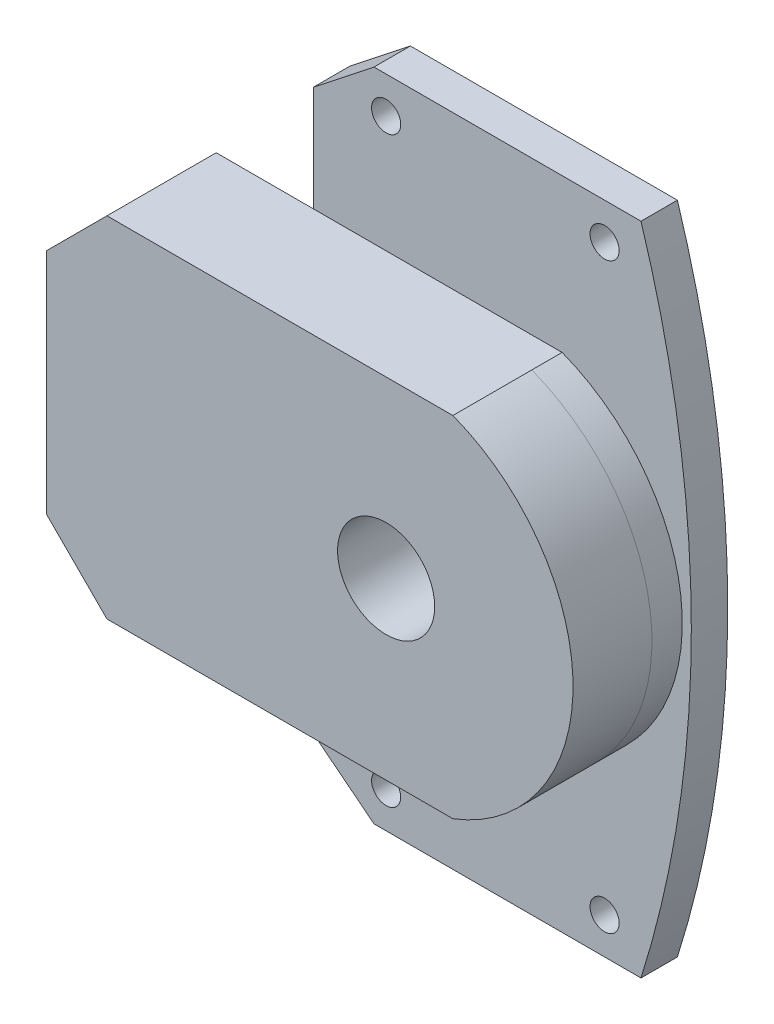
ISO-10303-21;
HEADER;
FILE_DESCRIPTION(('STEP AP214'),'2;1');
FILE_NAME('part.step','',(''),(''),'','','');
FILE_SCHEMA(('AUTOMOTIVE_DESIGN { 1 0 10303 214 1 1 1 1 }'));
ENDSEC;
DATA;
#1=APPLICATION_CONTEXT('core data for automotive mechanical design processes');
#2=APPLICATION_PROTOCOL_DEFINITION('international standard','automotive_design',2000,#1);
#3=PRODUCT_CONTEXT('',#1,'mechanical');
#4=PRODUCT('Part','Part','',(#3));
#5=PRODUCT_RELATED_PRODUCT_CATEGORY('part','',(#4));
#6=PRODUCT_DEFINITION_FORMATION('','',#4);
#7=PRODUCT_DEFINITION_CONTEXT('part definition',#1,'design');
#8=PRODUCT_DEFINITION('design','',#6,#7);
#9=PRODUCT_DEFINITION_SHAPE('','',#8);
#10=(LENGTH_UNIT() NAMED_UNIT(*) SI_UNIT(.MILLI.,.METRE.));
#11=(NAMED_UNIT(*) PLANE_ANGLE_UNIT() SI_UNIT($,.RADIAN.));
#12=(NAMED_UNIT(*) SI_UNIT($,.STERADIAN.) SOLID_ANGLE_UNIT());
#13=UNCERTAINTY_MEASURE_WITH_UNIT(LENGTH_MEASURE(1.E-05),#10,'distance_accuracy_value','');
#14=(GEOMETRIC_REPRESENTATION_CONTEXT(3) GLOBAL_UNCERTAINTY_ASSIGNED_CONTEXT((#13)) GLOBAL_UNIT_ASSIGNED_CONTEXT((#10,
#11,#12)) REPRESENTATION_CONTEXT('',''));
#15=CARTESIAN_POINT('',(0.,0.,0.));
#16=DIRECTION('',(0.,0.,1.));
#17=DIRECTION('',(1.,0.,0.));
#18=AXIS2_PLACEMENT_3D('',#15,#16,#17);
#19=CARTESIAN_POINT('',(-87.5169435511757,-10.5980462863294,-3.));
#20=DIRECTION('',(0.,0.,1.));
#21=DIRECTION('',(1.,0.,0.));
#22=AXIS2_PLACEMENT_3D('',#19,#20,#21);
#23=PLANE('',#22);
#24=CARTESIAN_POINT('',(-87.5169435511757,-10.5980462863294,-3.));
#25=DIRECTION('',(0.,0.,-1.));
#26=DIRECTION('',(1.,0.,0.));
#27=AXIS2_PLACEMENT_3D('',#24,#25,#26);
#28=CIRCLE('',#27,90.);
#29=CARTESIAN_POINT('',(-1.66241542365061,16.4019537136706,-3.));
#30=VERTEX_POINT('',#29);
#31=CARTESIAN_POINT('',(-1.66241542365062,-37.5980462863294,-3.));
#32=VERTEX_POINT('',#31);
#33=EDGE_CURVE('E143',#30,#32,#28,.T.);
#34=ORIENTED_EDGE('',*,*,#33,.T.);
#35=DIRECTION('',(-1.,0.,0.));
#36=VECTOR('',#35,1.);
#37=CARTESIAN_POINT('',(-23.6624154236506,-37.5980462863294,-3.));
#38=LINE('',#37,#36);
#39=CARTESIAN_POINT('',(-23.6624154236506,-37.5980462863294,-3.));
#40=VERTEX_POINT('',#39);
#41=EDGE_CURVE('E101',#32,#40,#38,.T.);
#42=ORIENTED_EDGE('',*,*,#41,.T.);
#43=DIRECTION('',(-0.785278343538106,0.619142893983327,0.));
#44=VECTOR('',#43,1.);
#45=CARTESIAN_POINT('',(-28.6624154236506,-33.6558587863294,-3.));
#46=LINE('',#45,#44);
#47=CARTESIAN_POINT('',(-28.6624154236506,-33.6558587863294,-3.));
#48=VERTEX_POINT('',#47);
#49=EDGE_CURVE('E114',#40,#48,#46,.T.);
#50=ORIENTED_EDGE('',*,*,#49,.T.);
#51=DIRECTION('',(0.,1.,0.));
#52=VECTOR('',#51,1.);
#53=CARTESIAN_POINT('',(-28.6624154236506,12.4597662136706,-3.));
#54=LINE('',#53,#52);
#55=CARTESIAN_POINT('',(-28.6624154236506,12.4597662136706,-3.));
#56=VERTEX_POINT('',#55);
#57=EDGE_CURVE('E108',#48,#56,#54,.T.);
#58=ORIENTED_EDGE('',*,*,#57,.T.);
#59=DIRECTION('',(0.785278343538106,0.619142893983326,0.));
#60=VECTOR('',#59,1.);
#61=CARTESIAN_POINT('',(-23.6624154236506,16.4019537136706,-3.));
#62=LINE('',#61,#60);
#63=CARTESIAN_POINT('',(-23.6624154236506,16.4019537136706,-3.));
#64=VERTEX_POINT('',#63);
#65=EDGE_CURVE('E112',#56,#64,#62,.T.);
#66=ORIENTED_EDGE('',*,*,#65,.T.);
#67=DIRECTION('',(1.,0.,0.));
#68=VECTOR('',#67,1.);
#69=CARTESIAN_POINT('',(-23.6624154236506,16.4019537136706,-3.));
#70=LINE('',#69,#68);
#71=EDGE_CURVE('E64',#64,#30,#70,.T.);
#72=ORIENTED_EDGE('',*,*,#71,.T.);
#73=EDGE_LOOP('',(#34,#42,#50,#58,#66,#72));
#74=FACE_BOUND('',#73,.T.);
#75=CARTESIAN_POINT('',(-13.6624154236506,-10.5980462863294,-3.));
#76=DIRECTION('',(0.,0.,-1.));
#77=DIRECTION('',(-1.,0.,0.));
#78=AXIS2_PLACEMENT_3D('',#75,#76,#77);
#79=CIRCLE('',#78,3.9);
#80=CARTESIAN_POINT('',(-17.5624154236506,-10.5980462863294,-3.));
#81=VERTEX_POINT('',#80);
#82=EDGE_CURVE('E136',#81,#81,#79,.T.);
#83=ORIENTED_EDGE('',*,*,#82,.F.);
#84=EDGE_LOOP('',(#83));
#85=FACE_BOUND('',#84,.T.);
#86=CARTESIAN_POINT('',(-4.66241542365062,13.4019537136706,-3.));
#87=DIRECTION('',(0.,0.,-1.));
#88=DIRECTION('',(-1.,0.,0.));
#89=AXIS2_PLACEMENT_3D('',#86,#87,#88);
#90=CIRCLE('',#89,1.2);
#91=CARTESIAN_POINT('',(-5.86241542365062,13.4019537136706,-3.));
#92=VERTEX_POINT('',#91);
#93=EDGE_CURVE('E217',#92,#92,#90,.T.);
#94=ORIENTED_EDGE('',*,*,#93,.F.);
#95=EDGE_LOOP('',(#94));
#96=FACE_BOUND('',#95,.T.);
#97=CARTESIAN_POINT('',(-22.6624154236506,13.4019537136706,-3.));
#98=DIRECTION('',(0.,0.,-1.));
#99=DIRECTION('',(1.,0.,0.));
#100=AXIS2_PLACEMENT_3D('',#97,#98,#99);
#101=CIRCLE('',#100,1.2);
#102=CARTESIAN_POINT('',(-21.4624154236506,13.4019537136706,-3.));
#103=VERTEX_POINT('',#102);
#104=EDGE_CURVE('E211',#103,#103,#101,.T.);
#105=ORIENTED_EDGE('',*,*,#104,.F.);
#106=EDGE_LOOP('',(#105));
#107=FACE_BOUND('',#106,.T.);
#108=CARTESIAN_POINT('',(-4.66241542365062,-34.5980462863294,-3.));
#109=DIRECTION('',(0.,0.,-1.));
#110=DIRECTION('',(1.,0.,0.));
#111=AXIS2_PLACEMENT_3D('',#108,#109,#110);
#112=CIRCLE('',#111,1.2);
#113=CARTESIAN_POINT('',(-3.46241542365062,-34.5980462863294,-3.));
#114=VERTEX_POINT('',#113);
#115=EDGE_CURVE('E205',#114,#114,#112,.T.);
#116=ORIENTED_EDGE('',*,*,#115,.F.);
#117=EDGE_LOOP('',(#116));
#118=FACE_BOUND('',#117,.T.);
#119=CARTESIAN_POINT('',(-22.6624154236506,-34.5980462863294,-3.));
#120=DIRECTION('',(0.,0.,-1.));
#121=DIRECTION('',(-1.,0.,0.));
#122=AXIS2_PLACEMENT_3D('',#119,#120,#121);
#123=CIRCLE('',#122,1.2);
#124=CARTESIAN_POINT('',(-23.8624154236506,-34.5980462863294,-3.));
#125=VERTEX_POINT('',#124);
#126=EDGE_CURVE('E196',#125,#125,#123,.T.);
#127=ORIENTED_EDGE('',*,*,#126,.F.);
#128=EDGE_LOOP('',(#127));
#129=FACE_BOUND('',#128,.T.);
#130=ADVANCED_FACE('F47',(#74,#85,#96,#107,#118,#129),#23,.F.);
#131=CARTESIAN_POINT('',(-87.5169435511757,-10.5980462863294,0.));
#132=DIRECTION('',(0.,0.,1.));
#133=DIRECTION('',(1.,0.,0.));
#134=AXIS2_PLACEMENT_3D('',#131,#132,#133);
#135=PLANE('',#134);
#136=CARTESIAN_POINT('',(-4.66241542365062,-34.5980462863294,0.));
#137=DIRECTION('',(0.,0.,-1.));
#138=DIRECTION('',(1.,0.,0.));
#139=AXIS2_PLACEMENT_3D('',#136,#137,#138);
#140=CIRCLE('',#139,1.2);
#141=CARTESIAN_POINT('',(-3.46241542365062,-34.5980462863294,0.));
#142=VERTEX_POINT('',#141);
#143=EDGE_CURVE('E202',#142,#142,#140,.T.);
#144=ORIENTED_EDGE('',*,*,#143,.T.);
#145=EDGE_LOOP('',(#144));
#146=FACE_BOUND('',#145,.T.);
#147=CARTESIAN_POINT('',(-4.66241542365062,13.4019537136706,0.));
#148=DIRECTION('',(0.,0.,-1.));
#149=DIRECTION('',(-1.,0.,0.));
#150=AXIS2_PLACEMENT_3D('',#147,#148,#149);
#151=CIRCLE('',#150,1.2);
#152=CARTESIAN_POINT('',(-5.86241542365062,13.4019537136706,0.));
#153=VERTEX_POINT('',#152);
#154=EDGE_CURVE('E214',#153,#153,#151,.T.);
#155=ORIENTED_EDGE('',*,*,#154,.T.);
#156=EDGE_LOOP('',(#155));
#157=FACE_BOUND('',#156,.T.);
#158=CARTESIAN_POINT('',(-87.5169435511757,-10.5980462863294,0.));
#159=DIRECTION('',(0.,0.,-1.));
#160=DIRECTION('',(1.,0.,0.));
#161=AXIS2_PLACEMENT_3D('',#158,#159,#160);
#162=CIRCLE('',#161,90.);
#163=CARTESIAN_POINT('',(-1.66241542365061,16.4019537136706,0.));
#164=VERTEX_POINT('',#163);
#165=CARTESIAN_POINT('',(-1.66241542365062,-37.5980462863294,0.));
#166=VERTEX_POINT('',#165);
#167=EDGE_CURVE('E132',#164,#166,#162,.T.);
#168=ORIENTED_EDGE('',*,*,#167,.F.);
#169=DIRECTION('',(1.,0.,0.));
#170=VECTOR('',#169,1.);
#171=CARTESIAN_POINT('',(-23.6624154236506,16.4019537136706,0.));
#172=LINE('',#171,#170);
#173=CARTESIAN_POINT('',(-23.6624154236506,16.4019537136706,0.));
#174=VERTEX_POINT('',#173);
#175=EDGE_CURVE('E93',#174,#164,#172,.T.);
#176=ORIENTED_EDGE('',*,*,#175,.F.);
#177=DIRECTION('',(0.785278343538106,0.619142893983326,0.));
#178=VECTOR('',#177,1.);
#179=CARTESIAN_POINT('',(-23.6624154236506,16.4019537136706,0.));
#180=LINE('',#179,#178);
#181=CARTESIAN_POINT('',(-28.6624154236506,12.4597662136706,0.));
#182=VERTEX_POINT('',#181);
#183=EDGE_CURVE('E87',#182,#174,#180,.T.);
#184=ORIENTED_EDGE('',*,*,#183,.F.);
#185=DIRECTION('',(0.,1.,0.));
#186=VECTOR('',#185,1.);
#187=CARTESIAN_POINT('',(-28.6624154236506,12.4597662136706,0.));
#188=LINE('',#187,#186);
#189=CARTESIAN_POINT('',(-28.6624154236506,-33.6558587863294,0.));
#190=VERTEX_POINT('',#189);
#191=EDGE_CURVE('E122',#190,#182,#188,.T.);
#192=ORIENTED_EDGE('',*,*,#191,.F.);
#193=DIRECTION('',(-0.785278343538106,0.619142893983327,0.));
#194=VECTOR('',#193,1.);
#195=CARTESIAN_POINT('',(-28.6624154236506,-33.6558587863294,0.));
#196=LINE('',#195,#194);
#197=CARTESIAN_POINT('',(-23.6624154236506,-37.5980462863294,0.));
#198=VERTEX_POINT('',#197);
#199=EDGE_CURVE('E138',#198,#190,#196,.T.);
#200=ORIENTED_EDGE('',*,*,#199,.F.);
#201=DIRECTION('',(-1.,0.,0.));
#202=VECTOR('',#201,1.);
#203=CARTESIAN_POINT('',(-23.6624154236506,-37.5980462863294,0.));
#204=LINE('',#203,#202);
#205=EDGE_CURVE('E135',#166,#198,#204,.T.);
#206=ORIENTED_EDGE('',*,*,#205,.F.);
#207=EDGE_LOOP('',(#168,#176,#184,#192,#200,#206));
#208=FACE_BOUND('',#207,.T.);
#209=CARTESIAN_POINT('',(-13.6624154236506,-10.5980462863294,0.));
#210=DIRECTION('',(0.,0.,-1.));
#211=DIRECTION('',(-1.,0.,0.));
#212=AXIS2_PLACEMENT_3D('',#209,#210,#211);
#213=CIRCLE('',#212,3.9);
#214=CARTESIAN_POINT('',(-17.5624154236506,-10.5980462863294,0.));
#215=VERTEX_POINT('',#214);
#216=EDGE_CURVE('E220',#215,#215,#213,.T.);
#217=ORIENTED_EDGE('',*,*,#216,.T.);
#218=EDGE_LOOP('',(#217));
#219=FACE_BOUND('',#218,.T.);
#220=CARTESIAN_POINT('',(-22.6624154236506,13.4019537136706,0.));
#221=DIRECTION('',(0.,0.,-1.));
#222=DIRECTION('',(1.,0.,0.));
#223=AXIS2_PLACEMENT_3D('',#220,#221,#222);
#224=CIRCLE('',#223,1.2);
#225=CARTESIAN_POINT('',(-21.4624154236506,13.4019537136706,0.));
#226=VERTEX_POINT('',#225);
#227=EDGE_CURVE('E208',#226,#226,#224,.T.);
#228=ORIENTED_EDGE('',*,*,#227,.T.);
#229=EDGE_LOOP('',(#228));
#230=FACE_BOUND('',#229,.T.);
#231=CARTESIAN_POINT('',(-22.6624154236506,-34.5980462863294,0.));
#232=DIRECTION('',(0.,0.,-1.));
#233=DIRECTION('',(-1.,0.,0.));
#234=AXIS2_PLACEMENT_3D('',#231,#232,#233);
#235=CIRCLE('',#234,1.2);
#236=CARTESIAN_POINT('',(-23.8624154236506,-34.5980462863294,0.));
#237=VERTEX_POINT('',#236);
#238=EDGE_CURVE('E199',#237,#237,#235,.T.);
#239=ORIENTED_EDGE('',*,*,#238,.T.);
#240=EDGE_LOOP('',(#239));
#241=FACE_BOUND('',#240,.T.);
#242=ADVANCED_FACE('F152',(#146,#157,#208,#219,#230,#241),#135,.T.);
#243=CARTESIAN_POINT('',(-87.5169435511757,-10.5980462863294,-3.));
#244=DIRECTION('',(0.,0.,1.));
#245=DIRECTION('',(1.,0.,0.));
#246=AXIS2_PLACEMENT_3D('',#243,#244,#245);
#247=CYLINDRICAL_SURFACE('',#246,90.);
#248=ORIENTED_EDGE('',*,*,#167,.T.);
#249=DIRECTION('',(0.,0.,1.));
#250=VECTOR('',#249,1.);
#251=CARTESIAN_POINT('',(-1.66241542365062,-37.5980462863294,-3.));
#252=LINE('',#251,#250);
#253=EDGE_CURVE('E12',#32,#166,#252,.T.);
#254=ORIENTED_EDGE('',*,*,#253,.F.);
#255=ORIENTED_EDGE('',*,*,#33,.F.);
#256=DIRECTION('',(0.,0.,1.));
#257=VECTOR('',#256,1.);
#258=CARTESIAN_POINT('',(-1.66241542365061,16.4019537136706,-3.));
#259=LINE('',#258,#257);
#260=EDGE_CURVE('E128',#30,#164,#259,.T.);
#261=ORIENTED_EDGE('',*,*,#260,.T.);
#262=EDGE_LOOP('',(#248,#254,#255,#261));
#263=FACE_BOUND('',#262,.T.);
#264=ADVANCED_FACE('F49',(#263),#247,.T.);
#265=CARTESIAN_POINT('',(-23.6624154236506,-37.5980462863294,-3.));
#266=DIRECTION('',(0.,1.,0.));
#267=DIRECTION('',(0.,0.,1.));
#268=AXIS2_PLACEMENT_3D('',#265,#266,#267);
#269=PLANE('',#268);
#270=ORIENTED_EDGE('',*,*,#205,.T.);
#271=DIRECTION('',(0.,0.,1.));
#272=VECTOR('',#271,1.);
#273=CARTESIAN_POINT('',(-23.6624154236506,-37.5980462863294,-3.));
#274=LINE('',#273,#272);
#275=EDGE_CURVE('E56',#40,#198,#274,.T.);
#276=ORIENTED_EDGE('',*,*,#275,.F.);
#277=ORIENTED_EDGE('',*,*,#41,.F.);
#278=ORIENTED_EDGE('',*,*,#253,.T.);
#279=EDGE_LOOP('',(#270,#276,#277,#278));
#280=FACE_BOUND('',#279,.T.);
#281=ADVANCED_FACE('F289',(#280),#269,.F.);
#282=CARTESIAN_POINT('',(-28.6624154236506,-33.6558587863294,-3.));
#283=DIRECTION('',(0.619142893983327,0.785278343538106,0.));
#284=DIRECTION('',(-0.785278343538106,0.619142893983327,0.));
#285=AXIS2_PLACEMENT_3D('',#282,#283,#284);
#286=PLANE('',#285);
#287=ORIENTED_EDGE('',*,*,#199,.T.);
#288=DIRECTION('',(0.,0.,1.));
#289=VECTOR('',#288,1.);
#290=CARTESIAN_POINT('',(-28.6624154236506,-33.6558587863294,-3.));
#291=LINE('',#290,#289);
#292=EDGE_CURVE('E123',#48,#190,#291,.T.);
#293=ORIENTED_EDGE('',*,*,#292,.F.);
#294=ORIENTED_EDGE('',*,*,#49,.F.);
#295=ORIENTED_EDGE('',*,*,#275,.T.);
#296=EDGE_LOOP('',(#287,#293,#294,#295));
#297=FACE_BOUND('',#296,.T.);
#298=ADVANCED_FACE('F149',(#297),#286,.F.);
#299=CARTESIAN_POINT('',(-28.6624154236506,12.4597662136706,-3.));
#300=DIRECTION('',(1.,0.,0.));
#301=DIRECTION('',(0.,1.,0.));
#302=AXIS2_PLACEMENT_3D('',#299,#300,#301);
#303=PLANE('',#302);
#304=ORIENTED_EDGE('',*,*,#191,.T.);
#305=DIRECTION('',(0.,0.,1.));
#306=VECTOR('',#305,1.);
#307=CARTESIAN_POINT('',(-28.6624154236506,12.4597662136706,-3.));
#308=LINE('',#307,#306);
#309=EDGE_CURVE('E119',#56,#182,#308,.T.);
#310=ORIENTED_EDGE('',*,*,#309,.F.);
#311=ORIENTED_EDGE('',*,*,#57,.F.);
#312=ORIENTED_EDGE('',*,*,#292,.T.);
#313=EDGE_LOOP('',(#304,#310,#311,#312));
#314=FACE_BOUND('',#313,.T.);
#315=ADVANCED_FACE('F120',(#314),#303,.F.);
#316=CARTESIAN_POINT('',(-23.6624154236506,16.4019537136706,-3.));
#317=DIRECTION('',(0.619142893983326,-0.785278343538106,0.));
#318=DIRECTION('',(0.785278343538106,0.619142893983326,0.));
#319=AXIS2_PLACEMENT_3D('',#316,#317,#318);
#320=PLANE('',#319);
#321=ORIENTED_EDGE('',*,*,#183,.T.);
#322=DIRECTION('',(0.,0.,1.));
#323=VECTOR('',#322,1.);
#324=CARTESIAN_POINT('',(-23.6624154236506,16.4019537136706,-3.));
#325=LINE('',#324,#323);
#326=EDGE_CURVE('E124',#64,#174,#325,.T.);
#327=ORIENTED_EDGE('',*,*,#326,.F.);
#328=ORIENTED_EDGE('',*,*,#65,.F.);
#329=ORIENTED_EDGE('',*,*,#309,.T.);
#330=EDGE_LOOP('',(#321,#327,#328,#329));
#331=FACE_BOUND('',#330,.T.);
#332=ADVANCED_FACE('F126',(#331),#320,.F.);
#333=CARTESIAN_POINT('',(-23.6624154236506,16.4019537136706,-3.));
#334=DIRECTION('',(0.,-1.,0.));
#335=DIRECTION('',(0.,0.,-1.));
#336=AXIS2_PLACEMENT_3D('',#333,#334,#335);
#337=PLANE('',#336);
#338=ORIENTED_EDGE('',*,*,#175,.T.);
#339=ORIENTED_EDGE('',*,*,#260,.F.);
#340=ORIENTED_EDGE('',*,*,#71,.F.);
#341=ORIENTED_EDGE('',*,*,#326,.T.);
#342=EDGE_LOOP('',(#338,#339,#340,#341));
#343=FACE_BOUND('',#342,.T.);
#344=ADVANCED_FACE('F157',(#343),#337,.F.);
#345=CARTESIAN_POINT('',(-13.6624154236506,-10.5980462863294,-3.));
#346=DIRECTION('',(0.,0.,1.));
#347=DIRECTION('',(1.,0.,0.));
#348=AXIS2_PLACEMENT_3D('',#345,#346,#347);
#349=CYLINDRICAL_SURFACE('',#348,3.9);
#350=ORIENTED_EDGE('',*,*,#82,.T.);
#351=EDGE_LOOP('',(#350));
#352=FACE_BOUND('',#351,.T.);
#353=ORIENTED_EDGE('',*,*,#216,.F.);
#354=EDGE_LOOP('',(#353));
#355=FACE_BOUND('',#354,.T.);
#356=ADVANCED_FACE('F159',(#352,#355),#349,.F.);
#357=CARTESIAN_POINT('',(-4.66241542365062,13.4019537136706,-3.));
#358=DIRECTION('',(0.,0.,1.));
#359=DIRECTION('',(1.,0.,0.));
#360=AXIS2_PLACEMENT_3D('',#357,#358,#359);
#361=CYLINDRICAL_SURFACE('',#360,1.2);
#362=ORIENTED_EDGE('',*,*,#93,.T.);
#363=EDGE_LOOP('',(#362));
#364=FACE_BOUND('',#363,.T.);
#365=ORIENTED_EDGE('',*,*,#154,.F.);
#366=EDGE_LOOP('',(#365));
#367=FACE_BOUND('',#366,.T.);
#368=ADVANCED_FACE('F165',(#364,#367),#361,.F.);
#369=CARTESIAN_POINT('',(-22.6624154236506,13.4019537136706,-3.));
#370=DIRECTION('',(0.,0.,1.));
#371=DIRECTION('',(1.,0.,0.));
#372=AXIS2_PLACEMENT_3D('',#369,#370,#371);
#373=CYLINDRICAL_SURFACE('',#372,1.2);
#374=ORIENTED_EDGE('',*,*,#104,.T.);
#375=EDGE_LOOP('',(#374));
#376=FACE_BOUND('',#375,.T.);
#377=ORIENTED_EDGE('',*,*,#227,.F.);
#378=EDGE_LOOP('',(#377));
#379=FACE_BOUND('',#378,.T.);
#380=ADVANCED_FACE('F179',(#376,#379),#373,.F.);
#381=CARTESIAN_POINT('',(-4.66241542365062,-34.5980462863294,-3.));
#382=DIRECTION('',(0.,0.,1.));
#383=DIRECTION('',(1.,0.,0.));
#384=AXIS2_PLACEMENT_3D('',#381,#382,#383);
#385=CYLINDRICAL_SURFACE('',#384,1.2);
#386=ORIENTED_EDGE('',*,*,#115,.T.);
#387=EDGE_LOOP('',(#386));
#388=FACE_BOUND('',#387,.T.);
#389=ORIENTED_EDGE('',*,*,#143,.F.);
#390=EDGE_LOOP('',(#389));
#391=FACE_BOUND('',#390,.T.);
#392=ADVANCED_FACE('F183',(#388,#391),#385,.F.);
#393=CARTESIAN_POINT('',(-22.6624154236506,-34.5980462863294,-3.));
#394=DIRECTION('',(0.,0.,1.));
#395=DIRECTION('',(1.,0.,0.));
#396=AXIS2_PLACEMENT_3D('',#393,#394,#395);
#397=CYLINDRICAL_SURFACE('',#396,1.2);
#398=ORIENTED_EDGE('',*,*,#126,.T.);
#399=EDGE_LOOP('',(#398));
#400=FACE_BOUND('',#399,.T.);
#401=ORIENTED_EDGE('',*,*,#238,.F.);
#402=EDGE_LOOP('',(#401));
#403=FACE_BOUND('',#402,.T.);
#404=ADVANCED_FACE('F187',(#400,#403),#397,.F.);
#405=CLOSED_SHELL('',(#130,#242,#264,#281,#298,#315,#332,#344,#356,#368,#380,#392,#404));
#406=MANIFOLD_SOLID_BREP('B2',#405);
#407=CARTESIAN_POINT('',(-13.6624154236506,-10.5980462863294,1.74455679792347E-13));
#408=DIRECTION('',(0.,0.,1.));
#409=DIRECTION('',(1.,0.,0.));
#410=AXIS2_PLACEMENT_3D('',#407,#408,#409);
#411=PLANE('',#410);
#412=DIRECTION('',(-0.707106781186547,-0.707106781186548,0.));
#413=VECTOR('',#412,1.);
#414=CARTESIAN_POINT('',(-36.6624154236506,3.78695371367061,1.74455679792347E-13));
#415=LINE('',#414,#413);
#416=CARTESIAN_POINT('',(-36.6624154236506,3.78695371367061,1.74455679792347E-13));
#417=VERTEX_POINT('',#416);
#418=CARTESIAN_POINT('',(-41.6624154236506,-1.21304628632939,1.74455679792347E-13));
#419=VERTEX_POINT('',#418);
#420=EDGE_CURVE('E387',#417,#419,#415,.T.);
#421=ORIENTED_EDGE('',*,*,#420,.F.);
#422=DIRECTION('',(-1.,0.,0.));
#423=VECTOR('',#422,1.);
#424=CARTESIAN_POINT('',(-19.1624154236506,3.78695371367061,1.74455679792347E-13));
#425=LINE('',#424,#423);
#426=CARTESIAN_POINT('',(-8.16241542365062,3.78695371367061,1.74455679792347E-13));
#427=VERTEX_POINT('',#426);
#428=EDGE_CURVE('E371',#427,#417,#425,.T.);
#429=ORIENTED_EDGE('',*,*,#428,.F.);
#430=CARTESIAN_POINT('',(-13.6624154236506,-10.5980462863294,1.74455679792347E-13));
#431=DIRECTION('',(0.,0.,1.));
#432=DIRECTION('',(1.,0.,0.));
#433=AXIS2_PLACEMENT_3D('',#430,#431,#432);
#434=CIRCLE('',#433,15.4005917094117);
#435=CARTESIAN_POINT('',(-8.16241542365062,-24.9830462863294,1.74455679792347E-13));
#436=VERTEX_POINT('',#435);
#437=EDGE_CURVE('E381',#436,#427,#434,.T.);
#438=ORIENTED_EDGE('',*,*,#437,.F.);
#439=DIRECTION('',(1.,0.,0.));
#440=VECTOR('',#439,1.);
#441=CARTESIAN_POINT('',(-19.1624154236506,-24.9830462863294,1.74455679792347E-13));
#442=LINE('',#441,#440);
#443=CARTESIAN_POINT('',(-36.6624154236506,-24.9830462863294,1.74455679792347E-13));
#444=VERTEX_POINT('',#443);
#445=EDGE_CURVE('E405',#444,#436,#442,.T.);
#446=ORIENTED_EDGE('',*,*,#445,.F.);
#447=DIRECTION('',(0.707106781186548,-0.707106781186547,0.));
#448=VECTOR('',#447,1.);
#449=CARTESIAN_POINT('',(-41.6624154236506,-19.9830462863294,1.74455679792347E-13));
#450=LINE('',#449,#448);
#451=CARTESIAN_POINT('',(-41.6624154236506,-19.9830462863294,1.74455679792347E-13));
#452=VERTEX_POINT('',#451);
#453=EDGE_CURVE('E396',#452,#444,#450,.T.);
#454=ORIENTED_EDGE('',*,*,#453,.F.);
#455=DIRECTION('',(0.,-1.,0.));
#456=VECTOR('',#455,1.);
#457=CARTESIAN_POINT('',(-41.6624154236506,-1.21304628632939,1.74455679792347E-13));
#458=LINE('',#457,#456);
#459=EDGE_CURVE('E393',#419,#452,#458,.T.);
#460=ORIENTED_EDGE('',*,*,#459,.F.);
#461=EDGE_LOOP('',(#421,#429,#438,#446,#454,#460));
#462=FACE_BOUND('',#461,.T.);
#463=CARTESIAN_POINT('',(-29.4124154236506,-21.0780462863294,1.74455679792347E-13));
#464=DIRECTION('',(0.,0.,1.));
#465=DIRECTION('',(1.,0.,0.));
#466=AXIS2_PLACEMENT_3D('',#463,#464,#465);
#467=CIRCLE('',#466,1.98);
#468=CARTESIAN_POINT('',(-27.4324154236506,-21.0780462863294,1.74455679792347E-13));
#469=VERTEX_POINT('',#468);
#470=EDGE_CURVE('E394',#469,#469,#467,.T.);
#471=ORIENTED_EDGE('',*,*,#470,.T.);
#472=EDGE_LOOP('',(#471));
#473=FACE_BOUND('',#472,.T.);
#474=CARTESIAN_POINT('',(-29.4124154236506,-0.118046286329387,1.74455679792347E-13));
#475=DIRECTION('',(0.,0.,1.));
#476=DIRECTION('',(1.,0.,0.));
#477=AXIS2_PLACEMENT_3D('',#474,#475,#476);
#478=CIRCLE('',#477,1.98);
#479=CARTESIAN_POINT('',(-27.4324154236506,-0.118046286329387,1.74455679792347E-13));
#480=VERTEX_POINT('',#479);
#481=EDGE_CURVE('E399',#480,#480,#478,.T.);
#482=ORIENTED_EDGE('',*,*,#481,.T.);
#483=EDGE_LOOP('',(#482));
#484=FACE_BOUND('',#483,.T.);
#485=CARTESIAN_POINT('',(-13.6624154236506,-10.5980462863294,1.74455679792347E-13));
#486=DIRECTION('',(0.,0.,1.));
#487=DIRECTION('',(1.,0.,0.));
#488=AXIS2_PLACEMENT_3D('',#485,#486,#487);
#489=CIRCLE('',#488,6.3);
#490=CARTESIAN_POINT('',(-7.36241542365062,-10.5980462863294,1.74455679792347E-13));
#491=VERTEX_POINT('',#490);
#492=EDGE_CURVE('E580',#491,#491,#489,.T.);
#493=ORIENTED_EDGE('',*,*,#492,.T.);
#494=EDGE_LOOP('',(#493));
#495=FACE_BOUND('',#494,.T.);
#496=CARTESIAN_POINT('',(-13.6624154236506,-1.07304628632939,1.74455679792347E-13));
#497=DIRECTION('',(0.,0.,1.));
#498=DIRECTION('',(1.,0.,0.));
#499=AXIS2_PLACEMENT_3D('',#496,#497,#498);
#500=CIRCLE('',#499,1.475);
#501=CARTESIAN_POINT('',(-12.1874154236506,-1.07304628632939,1.74455679792347E-13));
#502=VERTEX_POINT('',#501);
#503=EDGE_CURVE('E577',#502,#502,#500,.T.);
#504=ORIENTED_EDGE('',*,*,#503,.T.);
#505=EDGE_LOOP('',(#504));
#506=FACE_BOUND('',#505,.T.);
#507=CARTESIAN_POINT('',(-13.6624154236506,-20.1230462863294,1.74455679792347E-13));
#508=DIRECTION('',(0.,0.,1.));
#509=DIRECTION('',(1.,0.,0.));
#510=AXIS2_PLACEMENT_3D('',#507,#508,#509);
#511=CIRCLE('',#510,1.475);
#512=CARTESIAN_POINT('',(-12.1874154236506,-20.1230462863294,1.74455679792347E-13));
#513=VERTEX_POINT('',#512);
#514=EDGE_CURVE('E574',#513,#513,#511,.T.);
#515=ORIENTED_EDGE('',*,*,#514,.T.);
#516=EDGE_LOOP('',(#515));
#517=FACE_BOUND('',#516,.T.);
#518=CARTESIAN_POINT('',(-4.6821593025815,-19.5783024073986,1.74455679792347E-13));
#519=DIRECTION('',(0.,0.,1.));
#520=DIRECTION('',(1.,0.,0.));
#521=AXIS2_PLACEMENT_3D('',#518,#519,#520);
#522=CIRCLE('',#521,1.05);
#523=CARTESIAN_POINT('',(-3.6321593025815,-19.5783024073986,1.74455679792347E-13));
#524=VERTEX_POINT('',#523);
#525=EDGE_CURVE('E571',#524,#524,#522,.T.);
#526=ORIENTED_EDGE('',*,*,#525,.T.);
#527=EDGE_LOOP('',(#526));
#528=FACE_BOUND('',#527,.T.);
#529=CARTESIAN_POINT('',(-4.6821593025815,-1.61779016526022,1.74455679792347E-13));
#530=DIRECTION('',(0.,0.,1.));
#531=DIRECTION('',(1.,0.,0.));
#532=AXIS2_PLACEMENT_3D('',#529,#530,#531);
#533=CIRCLE('',#532,1.05);
#534=CARTESIAN_POINT('',(-3.6321593025815,-1.61779016526022,1.74455679792347E-13));
#535=VERTEX_POINT('',#534);
#536=EDGE_CURVE('E568',#535,#535,#533,.T.);
#537=ORIENTED_EDGE('',*,*,#536,.T.);
#538=EDGE_LOOP('',(#537));
#539=FACE_BOUND('',#538,.T.);
#540=CARTESIAN_POINT('',(-22.6426715447198,-1.61779016526022,1.74455679792347E-13));
#541=DIRECTION('',(0.,0.,1.));
#542=DIRECTION('',(1.,0.,0.));
#543=AXIS2_PLACEMENT_3D('',#540,#541,#542);
#544=CIRCLE('',#543,1.05);
#545=CARTESIAN_POINT('',(-21.5926715447198,-1.61779016526022,1.74455679792347E-13));
#546=VERTEX_POINT('',#545);
#547=EDGE_CURVE('E565',#546,#546,#544,.T.);
#548=ORIENTED_EDGE('',*,*,#547,.T.);
#549=EDGE_LOOP('',(#548));
#550=FACE_BOUND('',#549,.T.);
#551=CARTESIAN_POINT('',(-22.6426715447198,-19.5783024073986,1.74455679792347E-13));
#552=DIRECTION('',(0.,0.,1.));
#553=DIRECTION('',(1.,0.,0.));
#554=AXIS2_PLACEMENT_3D('',#551,#552,#553);
#555=CIRCLE('',#554,1.05);
#556=CARTESIAN_POINT('',(-21.5926715447198,-19.5783024073986,1.74455679792347E-13));
#557=VERTEX_POINT('',#556);
#558=EDGE_CURVE('E562',#557,#557,#555,.T.);
#559=ORIENTED_EDGE('',*,*,#558,.T.);
#560=EDGE_LOOP('',(#559));
#561=FACE_BOUND('',#560,.T.);
#562=CARTESIAN_POINT('',(-17.6624154236506,-3.66984305605386,1.74455679792347E-13));
#563=DIRECTION('',(0.,0.,1.));
#564=DIRECTION('',(1.,0.,0.));
#565=AXIS2_PLACEMENT_3D('',#562,#563,#564);
#566=CIRCLE('',#565,0.85);
#567=CARTESIAN_POINT('',(-16.8124154236506,-3.66984305605386,1.74455679792347E-13));
#568=VERTEX_POINT('',#567);
#569=EDGE_CURVE('E559',#568,#568,#566,.T.);
#570=ORIENTED_EDGE('',*,*,#569,.T.);
#571=EDGE_LOOP('',(#570));
#572=FACE_BOUND('',#571,.T.);
#573=CARTESIAN_POINT('',(-9.66241542365067,-17.5262495166049,1.74455679792347E-13));
#574=DIRECTION('',(0.,0.,1.));
#575=DIRECTION('',(1.,0.,0.));
#576=AXIS2_PLACEMENT_3D('',#573,#574,#575);
#577=CIRCLE('',#576,0.85);
#578=CARTESIAN_POINT('',(-8.81241542365067,-17.5262495166049,1.74455679792347E-13));
#579=VERTEX_POINT('',#578);
#580=EDGE_CURVE('E556',#579,#579,#577,.T.);
#581=ORIENTED_EDGE('',*,*,#580,.T.);
#582=EDGE_LOOP('',(#581));
#583=FACE_BOUND('',#582,.T.);
#584=ADVANCED_FACE('F328',(#462,#473,#484,#495,#506,#517,#528,#539,#550,#561,#572,#583),#411,.F.);
#585=CARTESIAN_POINT('',(-36.6624154236506,3.78695371367061,2.50000000000017));
#586=DIRECTION('',(0.707106781186548,-0.707106781186547,0.));
#587=DIRECTION('',(0.707106781186547,0.707106781186548,0.));
#588=AXIS2_PLACEMENT_3D('',#585,#586,#587);
#589=PLANE('',#588);
#590=ORIENTED_EDGE('',*,*,#420,.T.);
#591=DIRECTION('',(0.,0.,-1.));
#592=VECTOR('',#591,1.);
#593=CARTESIAN_POINT('',(-41.6624154236506,-1.21304628632939,2.50000000000017));
#594=LINE('',#593,#592);
#595=CARTESIAN_POINT('',(-41.6624154236506,-1.21304628632939,9.00000000000017));
#596=VERTEX_POINT('',#595);
#597=EDGE_CURVE('E45',#596,#419,#594,.T.);
#598=ORIENTED_EDGE('',*,*,#597,.F.);
#599=DIRECTION('',(-0.707106781186547,-0.707106781186548,0.));
#600=VECTOR('',#599,1.);
#601=CARTESIAN_POINT('',(-36.6624154236506,3.78695371367061,9.00000000000017));
#602=LINE('',#601,#600);
#603=CARTESIAN_POINT('',(-36.6624154236506,3.78695371367061,9.00000000000017));
#604=VERTEX_POINT('',#603);
#605=EDGE_CURVE('E389',#604,#596,#602,.T.);
#606=ORIENTED_EDGE('',*,*,#605,.F.);
#607=DIRECTION('',(0.,0.,-1.));
#608=VECTOR('',#607,1.);
#609=CARTESIAN_POINT('',(-36.6624154236506,3.78695371367061,2.50000000000017));
#610=LINE('',#609,#608);
#611=EDGE_CURVE('E377',#604,#417,#610,.T.);
#612=ORIENTED_EDGE('',*,*,#611,.T.);
#613=EDGE_LOOP('',(#590,#598,#606,#612));
#614=FACE_BOUND('',#613,.T.);
#615=ADVANCED_FACE('F330',(#614),#589,.F.);
#616=CARTESIAN_POINT('',(-41.6624154236506,-1.21304628632939,2.50000000000017));
#617=DIRECTION('',(1.,0.,0.));
#618=DIRECTION('',(0.,1.,0.));
#619=AXIS2_PLACEMENT_3D('',#616,#617,#618);
#620=PLANE('',#619);
#621=ORIENTED_EDGE('',*,*,#459,.T.);
#622=DIRECTION('',(0.,0.,-1.));
#623=VECTOR('',#622,1.);
#624=CARTESIAN_POINT('',(-41.6624154236506,-19.9830462863294,2.50000000000017));
#625=LINE('',#624,#623);
#626=CARTESIAN_POINT('',(-41.6624154236506,-19.9830462863294,9.00000000000017));
#627=VERTEX_POINT('',#626);
#628=EDGE_CURVE('E338',#627,#452,#625,.T.);
#629=ORIENTED_EDGE('',*,*,#628,.F.);
#630=DIRECTION('',(0.,-1.,0.));
#631=VECTOR('',#630,1.);
#632=CARTESIAN_POINT('',(-41.6624154236506,-19.9830462863294,9.00000000000017));
#633=LINE('',#632,#631);
#634=EDGE_CURVE('E683',#596,#627,#633,.T.);
#635=ORIENTED_EDGE('',*,*,#634,.F.);
#636=ORIENTED_EDGE('',*,*,#597,.T.);
#637=EDGE_LOOP('',(#621,#629,#635,#636));
#638=FACE_BOUND('',#637,.T.);
#639=ADVANCED_FACE('F439',(#638),#620,.F.);
#640=CARTESIAN_POINT('',(-41.6624154236506,-19.9830462863294,2.50000000000017));
#641=DIRECTION('',(0.707106781186547,0.707106781186548,0.));
#642=DIRECTION('',(-0.707106781186548,0.707106781186547,0.));
#643=AXIS2_PLACEMENT_3D('',#640,#641,#642);
#644=PLANE('',#643);
#645=ORIENTED_EDGE('',*,*,#453,.T.);
#646=DIRECTION('',(0.,0.,-1.));
#647=VECTOR('',#646,1.);
#648=CARTESIAN_POINT('',(-36.6624154236506,-24.9830462863294,2.50000000000017));
#649=LINE('',#648,#647);
#650=CARTESIAN_POINT('',(-36.6624154236506,-24.9830462863294,9.00000000000017));
#651=VERTEX_POINT('',#650);
#652=EDGE_CURVE('E408',#651,#444,#649,.T.);
#653=ORIENTED_EDGE('',*,*,#652,.F.);
#654=DIRECTION('',(0.707106781186548,-0.707106781186547,0.));
#655=VECTOR('',#654,1.);
#656=CARTESIAN_POINT('',(-36.6624154236506,-24.9830462863294,9.00000000000017));
#657=LINE('',#656,#655);
#658=EDGE_CURVE('E690',#627,#651,#657,.T.);
#659=ORIENTED_EDGE('',*,*,#658,.F.);
#660=ORIENTED_EDGE('',*,*,#628,.T.);
#661=EDGE_LOOP('',(#645,#653,#659,#660));
#662=FACE_BOUND('',#661,.T.);
#663=ADVANCED_FACE('F436',(#662),#644,.F.);
#664=CARTESIAN_POINT('',(-19.1624154236506,-24.9830462863294,2.50000000000017));
#665=DIRECTION('',(0.,1.,0.));
#666=DIRECTION('',(0.,0.,1.));
#667=AXIS2_PLACEMENT_3D('',#664,#665,#666);
#668=PLANE('',#667);
#669=ORIENTED_EDGE('',*,*,#445,.T.);
#670=DIRECTION('',(0.,0.,-1.));
#671=VECTOR('',#670,1.);
#672=CARTESIAN_POINT('',(-8.16241542365062,-24.9830462863294,2.50000000000017));
#673=LINE('',#672,#671);
#674=CARTESIAN_POINT('',(-8.16241542365062,-24.9830462863294,2.50000000000017));
#675=VERTEX_POINT('',#674);
#676=EDGE_CURVE('E411',#675,#436,#673,.T.);
#677=ORIENTED_EDGE('',*,*,#676,.F.);
#678=DIRECTION('',(0.,0.,-1.));
#679=VECTOR('',#678,1.);
#680=CARTESIAN_POINT('',(-8.16241542365061,-24.9830462863294,9.00000000000017));
#681=LINE('',#680,#679);
#682=CARTESIAN_POINT('',(-8.16241542365061,-24.9830462863294,9.00000000000017));
#683=VERTEX_POINT('',#682);
#684=EDGE_CURVE('E509',#683,#675,#681,.T.);
#685=ORIENTED_EDGE('',*,*,#684,.F.);
#686=DIRECTION('',(1.,0.,0.));
#687=VECTOR('',#686,1.);
#688=CARTESIAN_POINT('',(-8.16241542365062,-24.9830462863294,9.00000000000017));
#689=LINE('',#688,#687);
#690=EDGE_CURVE('E693',#651,#683,#689,.T.);
#691=ORIENTED_EDGE('',*,*,#690,.F.);
#692=ORIENTED_EDGE('',*,*,#652,.T.);
#693=EDGE_LOOP('',(#669,#677,#685,#691,#692));
#694=FACE_BOUND('',#693,.T.);
#695=ADVANCED_FACE('F432',(#694),#668,.F.);
#696=CARTESIAN_POINT('',(-13.6624154236506,-10.5980462863294,2.50000000000017));
#697=DIRECTION('',(0.,0.,-1.));
#698=DIRECTION('',(-1.,0.,0.));
#699=AXIS2_PLACEMENT_3D('',#696,#697,#698);
#700=CYLINDRICAL_SURFACE('',#699,15.4005917094117);
#701=ORIENTED_EDGE('',*,*,#437,.T.);
#702=DIRECTION('',(0.,0.,-1.));
#703=VECTOR('',#702,1.);
#704=CARTESIAN_POINT('',(-8.16241542365062,3.78695371367061,2.50000000000017));
#705=LINE('',#704,#703);
#706=CARTESIAN_POINT('',(-8.16241542365062,3.78695371367061,2.50000000000017));
#707=VERTEX_POINT('',#706);
#708=EDGE_CURVE('E347',#707,#427,#705,.T.);
#709=ORIENTED_EDGE('',*,*,#708,.F.);
#710=CARTESIAN_POINT('',(-13.6625687683024,-10.5980462863294,2.50000000000018));
#711=DIRECTION('',(0.,0.,1.));
#712=DIRECTION('',(0.357137822361272,-0.934051698697159,0.));
#713=AXIS2_PLACEMENT_3D('',#710,#711,#712);
#714=CIRCLE('',#713,15.4006464739206);
#715=EDGE_CURVE('E380',#675,#707,#714,.T.);
#716=ORIENTED_EDGE('',*,*,#715,.F.);
#717=ORIENTED_EDGE('',*,*,#676,.T.);
#718=EDGE_LOOP('',(#701,#709,#716,#717));
#719=FACE_BOUND('',#718,.T.);
#720=ADVANCED_FACE('F422',(#719),#700,.T.);
#721=CARTESIAN_POINT('',(-19.1624154236506,3.78695371367061,2.50000000000017));
#722=DIRECTION('',(0.,-1.,0.));
#723=DIRECTION('',(0.,0.,-1.));
#724=AXIS2_PLACEMENT_3D('',#721,#722,#723);
#725=PLANE('',#724);
#726=ORIENTED_EDGE('',*,*,#428,.T.);
#727=ORIENTED_EDGE('',*,*,#611,.F.);
#728=DIRECTION('',(-1.,0.,0.));
#729=VECTOR('',#728,1.);
#730=CARTESIAN_POINT('',(-36.6624154236506,3.78695371367061,9.00000000000017));
#731=LINE('',#730,#729);
#732=CARTESIAN_POINT('',(-8.16241542365062,3.78695371367061,9.00000000000017));
#733=VERTEX_POINT('',#732);
#734=EDGE_CURVE('E521',#733,#604,#731,.T.);
#735=ORIENTED_EDGE('',*,*,#734,.F.);
#736=DIRECTION('',(0.,0.,-1.));
#737=VECTOR('',#736,1.);
#738=CARTESIAN_POINT('',(-8.16241542365062,3.78695371367061,9.00000000000017));
#739=LINE('',#738,#737);
#740=EDGE_CURVE('E517',#733,#707,#739,.T.);
#741=ORIENTED_EDGE('',*,*,#740,.T.);
#742=ORIENTED_EDGE('',*,*,#708,.T.);
#743=EDGE_LOOP('',(#726,#727,#735,#741,#742));
#744=FACE_BOUND('',#743,.T.);
#745=ADVANCED_FACE('F375',(#744),#725,.F.);
#746=CARTESIAN_POINT('',(-29.4124154236506,-21.0780462863294,2.50000000000017));
#747=DIRECTION('',(0.,0.,-1.));
#748=DIRECTION('',(-1.,0.,0.));
#749=AXIS2_PLACEMENT_3D('',#746,#747,#748);
#750=CYLINDRICAL_SURFACE('',#749,1.98);
#751=CARTESIAN_POINT('',(-29.4124154236506,-21.0780462863294,2.50000000000017));
#752=DIRECTION('',(0.,0.,-1.));
#753=DIRECTION('',(-1.,0.,0.));
#754=AXIS2_PLACEMENT_3D('',#751,#752,#753);
#755=CIRCLE('',#754,1.98);
#756=CARTESIAN_POINT('',(-31.3924154236506,-21.0780462863294,2.50000000000017));
#757=VERTEX_POINT('',#756);
#758=EDGE_CURVE('E553',#757,#757,#755,.T.);
#759=ORIENTED_EDGE('',*,*,#758,.F.);
#760=EDGE_LOOP('',(#759));
#761=FACE_BOUND('',#760,.T.);
#762=ORIENTED_EDGE('',*,*,#470,.F.);
#763=EDGE_LOOP('',(#762));
#764=FACE_BOUND('',#763,.T.);
#765=ADVANCED_FACE('F450',(#761,#764),#750,.F.);
#766=CARTESIAN_POINT('',(-29.4124154236506,-0.118046286329387,2.50000000000017));
#767=DIRECTION('',(0.,0.,-1.));
#768=DIRECTION('',(-1.,0.,0.));
#769=AXIS2_PLACEMENT_3D('',#766,#767,#768);
#770=CYLINDRICAL_SURFACE('',#769,1.98);
#771=CARTESIAN_POINT('',(-29.4124154236506,-0.118046286329387,2.50000000000017));
#772=DIRECTION('',(0.,0.,-1.));
#773=DIRECTION('',(-1.,0.,0.));
#774=AXIS2_PLACEMENT_3D('',#771,#772,#773);
#775=CIRCLE('',#774,1.98);
#776=CARTESIAN_POINT('',(-31.3924154236506,-0.118046286329387,2.50000000000017));
#777=VERTEX_POINT('',#776);
#778=EDGE_CURVE('E550',#777,#777,#775,.T.);
#779=ORIENTED_EDGE('',*,*,#778,.F.);
#780=EDGE_LOOP('',(#779));
#781=FACE_BOUND('',#780,.T.);
#782=ORIENTED_EDGE('',*,*,#481,.F.);
#783=EDGE_LOOP('',(#782));
#784=FACE_BOUND('',#783,.T.);
#785=ADVANCED_FACE('F453',(#781,#784),#770,.F.);
#786=CARTESIAN_POINT('',(-13.6624154236506,-10.5980462863294,2.50000000000017));
#787=DIRECTION('',(0.,0.,-1.));
#788=DIRECTION('',(-1.,0.,0.));
#789=AXIS2_PLACEMENT_3D('',#786,#787,#788);
#790=CYLINDRICAL_SURFACE('',#789,6.3);
#791=CARTESIAN_POINT('',(-13.6624154236506,-10.5980462863294,2.50000000000017));
#792=DIRECTION('',(0.,0.,-1.));
#793=DIRECTION('',(-1.,0.,0.));
#794=AXIS2_PLACEMENT_3D('',#791,#792,#793);
#795=CIRCLE('',#794,6.3);
#796=CARTESIAN_POINT('',(-19.9624154236506,-10.5980462863294,2.50000000000017));
#797=VERTEX_POINT('',#796);
#798=EDGE_CURVE('E547',#797,#797,#795,.T.);
#799=ORIENTED_EDGE('',*,*,#798,.F.);
#800=EDGE_LOOP('',(#799));
#801=FACE_BOUND('',#800,.T.);
#802=ORIENTED_EDGE('',*,*,#492,.F.);
#803=EDGE_LOOP('',(#802));
#804=FACE_BOUND('',#803,.T.);
#805=ADVANCED_FACE('F457',(#801,#804),#790,.F.);
#806=CARTESIAN_POINT('',(-13.6624154236506,-1.07304628632939,2.50000000000017));
#807=DIRECTION('',(0.,0.,-1.));
#808=DIRECTION('',(-1.,0.,0.));
#809=AXIS2_PLACEMENT_3D('',#806,#807,#808);
#810=CYLINDRICAL_SURFACE('',#809,1.475);
#811=CARTESIAN_POINT('',(-13.6624154236506,-1.07304628632939,2.50000000000017));
#812=DIRECTION('',(0.,0.,-1.));
#813=DIRECTION('',(-1.,0.,0.));
#814=AXIS2_PLACEMENT_3D('',#811,#812,#813);
#815=CIRCLE('',#814,1.475);
#816=CARTESIAN_POINT('',(-15.1374154236506,-1.07304628632939,2.50000000000017));
#817=VERTEX_POINT('',#816);
#818=EDGE_CURVE('E544',#817,#817,#815,.T.);
#819=ORIENTED_EDGE('',*,*,#818,.F.);
#820=EDGE_LOOP('',(#819));
#821=FACE_BOUND('',#820,.T.);
#822=ORIENTED_EDGE('',*,*,#503,.F.);
#823=EDGE_LOOP('',(#822));
#824=FACE_BOUND('',#823,.T.);
#825=ADVANCED_FACE('F461',(#821,#824),#810,.F.);
#826=CARTESIAN_POINT('',(-13.6624154236506,-20.1230462863294,2.50000000000017));
#827=DIRECTION('',(0.,0.,-1.));
#828=DIRECTION('',(-1.,0.,0.));
#829=AXIS2_PLACEMENT_3D('',#826,#827,#828);
#830=CYLINDRICAL_SURFACE('',#829,1.475);
#831=CARTESIAN_POINT('',(-13.6624154236506,-20.1230462863294,2.50000000000017));
#832=DIRECTION('',(0.,0.,-1.));
#833=DIRECTION('',(-1.,0.,0.));
#834=AXIS2_PLACEMENT_3D('',#831,#832,#833);
#835=CIRCLE('',#834,1.475);
#836=CARTESIAN_POINT('',(-15.1374154236506,-20.1230462863294,2.50000000000017));
#837=VERTEX_POINT('',#836);
#838=EDGE_CURVE('E541',#837,#837,#835,.T.);
#839=ORIENTED_EDGE('',*,*,#838,.F.);
#840=EDGE_LOOP('',(#839));
#841=FACE_BOUND('',#840,.T.);
#842=ORIENTED_EDGE('',*,*,#514,.F.);
#843=EDGE_LOOP('',(#842));
#844=FACE_BOUND('',#843,.T.);
#845=ADVANCED_FACE('F465',(#841,#844),#830,.F.);
#846=CARTESIAN_POINT('',(-4.6821593025815,-19.5783024073986,2.50000000000017));
#847=DIRECTION('',(0.,0.,-1.));
#848=DIRECTION('',(-1.,0.,0.));
#849=AXIS2_PLACEMENT_3D('',#846,#847,#848);
#850=CYLINDRICAL_SURFACE('',#849,1.05);
#851=CARTESIAN_POINT('',(-4.6821593025815,-19.5783024073986,2.50000000000017));
#852=DIRECTION('',(0.,0.,-1.));
#853=DIRECTION('',(-1.,0.,0.));
#854=AXIS2_PLACEMENT_3D('',#851,#852,#853);
#855=CIRCLE('',#854,1.05);
#856=CARTESIAN_POINT('',(-5.7321593025815,-19.5783024073986,2.50000000000017));
#857=VERTEX_POINT('',#856);
#858=EDGE_CURVE('E538',#857,#857,#855,.T.);
#859=ORIENTED_EDGE('',*,*,#858,.F.);
#860=EDGE_LOOP('',(#859));
#861=FACE_BOUND('',#860,.T.);
#862=ORIENTED_EDGE('',*,*,#525,.F.);
#863=EDGE_LOOP('',(#862));
#864=FACE_BOUND('',#863,.T.);
#865=ADVANCED_FACE('F469',(#861,#864),#850,.F.);
#866=CARTESIAN_POINT('',(-4.6821593025815,-1.61779016526022,2.50000000000017));
#867=DIRECTION('',(0.,0.,-1.));
#868=DIRECTION('',(-1.,0.,0.));
#869=AXIS2_PLACEMENT_3D('',#866,#867,#868);
#870=CYLINDRICAL_SURFACE('',#869,1.05);
#871=CARTESIAN_POINT('',(-4.6821593025815,-1.61779016526022,2.50000000000017));
#872=DIRECTION('',(0.,0.,-1.));
#873=DIRECTION('',(-1.,0.,0.));
#874=AXIS2_PLACEMENT_3D('',#871,#872,#873);
#875=CIRCLE('',#874,1.05);
#876=CARTESIAN_POINT('',(-5.7321593025815,-1.61779016526022,2.50000000000017));
#877=VERTEX_POINT('',#876);
#878=EDGE_CURVE('E535',#877,#877,#875,.T.);
#879=ORIENTED_EDGE('',*,*,#878,.F.);
#880=EDGE_LOOP('',(#879));
#881=FACE_BOUND('',#880,.T.);
#882=ORIENTED_EDGE('',*,*,#536,.F.);
#883=EDGE_LOOP('',(#882));
#884=FACE_BOUND('',#883,.T.);
#885=ADVANCED_FACE('F473',(#881,#884),#870,.F.);
#886=CARTESIAN_POINT('',(-22.6426715447198,-1.61779016526022,2.50000000000017));
#887=DIRECTION('',(0.,0.,-1.));
#888=DIRECTION('',(-1.,0.,0.));
#889=AXIS2_PLACEMENT_3D('',#886,#887,#888);
#890=CYLINDRICAL_SURFACE('',#889,1.05);
#891=CARTESIAN_POINT('',(-22.6426715447198,-1.61779016526022,2.50000000000017));
#892=DIRECTION('',(0.,0.,-1.));
#893=DIRECTION('',(-1.,0.,0.));
#894=AXIS2_PLACEMENT_3D('',#891,#892,#893);
#895=CIRCLE('',#894,1.05);
#896=CARTESIAN_POINT('',(-23.6926715447198,-1.61779016526022,2.50000000000017));
#897=VERTEX_POINT('',#896);
#898=EDGE_CURVE('E532',#897,#897,#895,.T.);
#899=ORIENTED_EDGE('',*,*,#898,.F.);
#900=EDGE_LOOP('',(#899));
#901=FACE_BOUND('',#900,.T.);
#902=ORIENTED_EDGE('',*,*,#547,.F.);
#903=EDGE_LOOP('',(#902));
#904=FACE_BOUND('',#903,.T.);
#905=ADVANCED_FACE('F477',(#901,#904),#890,.F.);
#906=CARTESIAN_POINT('',(-22.6426715447198,-19.5783024073986,2.50000000000017));
#907=DIRECTION('',(0.,0.,-1.));
#908=DIRECTION('',(-1.,0.,0.));
#909=AXIS2_PLACEMENT_3D('',#906,#907,#908);
#910=CYLINDRICAL_SURFACE('',#909,1.05);
#911=CARTESIAN_POINT('',(-22.6426715447198,-19.5783024073986,2.50000000000017));
#912=DIRECTION('',(0.,0.,-1.));
#913=DIRECTION('',(-1.,0.,0.));
#914=AXIS2_PLACEMENT_3D('',#911,#912,#913);
#915=CIRCLE('',#914,1.05);
#916=CARTESIAN_POINT('',(-23.6926715447198,-19.5783024073986,2.50000000000017));
#917=VERTEX_POINT('',#916);
#918=EDGE_CURVE('E529',#917,#917,#915,.T.);
#919=ORIENTED_EDGE('',*,*,#918,.F.);
#920=EDGE_LOOP('',(#919));
#921=FACE_BOUND('',#920,.T.);
#922=ORIENTED_EDGE('',*,*,#558,.F.);
#923=EDGE_LOOP('',(#922));
#924=FACE_BOUND('',#923,.T.);
#925=ADVANCED_FACE('F481',(#921,#924),#910,.F.);
#926=CARTESIAN_POINT('',(-17.6624154236506,-3.66984305605386,2.50000000000017));
#927=DIRECTION('',(0.,0.,-1.));
#928=DIRECTION('',(-1.,0.,0.));
#929=AXIS2_PLACEMENT_3D('',#926,#927,#928);
#930=CYLINDRICAL_SURFACE('',#929,0.85);
#931=CARTESIAN_POINT('',(-17.6624154236506,-3.66984305605386,2.50000000000017));
#932=DIRECTION('',(0.,0.,-1.));
#933=DIRECTION('',(-1.,0.,0.));
#934=AXIS2_PLACEMENT_3D('',#931,#932,#933);
#935=CIRCLE('',#934,0.85);
#936=CARTESIAN_POINT('',(-18.5124154236506,-3.66984305605386,2.50000000000017));
#937=VERTEX_POINT('',#936);
#938=EDGE_CURVE('E526',#937,#937,#935,.T.);
#939=ORIENTED_EDGE('',*,*,#938,.F.);
#940=EDGE_LOOP('',(#939));
#941=FACE_BOUND('',#940,.T.);
#942=ORIENTED_EDGE('',*,*,#569,.F.);
#943=EDGE_LOOP('',(#942));
#944=FACE_BOUND('',#943,.T.);
#945=ADVANCED_FACE('F485',(#941,#944),#930,.F.);
#946=CARTESIAN_POINT('',(-9.66241542365067,-17.5262495166049,2.50000000000017));
#947=DIRECTION('',(0.,0.,-1.));
#948=DIRECTION('',(-1.,0.,0.));
#949=AXIS2_PLACEMENT_3D('',#946,#947,#948);
#950=CYLINDRICAL_SURFACE('',#949,0.85);
#951=CARTESIAN_POINT('',(-9.66241542365067,-17.5262495166049,2.50000000000017));
#952=DIRECTION('',(0.,0.,-1.));
#953=DIRECTION('',(-1.,0.,0.));
#954=AXIS2_PLACEMENT_3D('',#951,#952,#953);
#955=CIRCLE('',#954,0.85);
#956=CARTESIAN_POINT('',(-10.5124154236507,-17.5262495166049,2.50000000000017));
#957=VERTEX_POINT('',#956);
#958=EDGE_CURVE('E516',#957,#957,#955,.T.);
#959=ORIENTED_EDGE('',*,*,#958,.F.);
#960=EDGE_LOOP('',(#959));
#961=FACE_BOUND('',#960,.T.);
#962=ORIENTED_EDGE('',*,*,#580,.F.);
#963=EDGE_LOOP('',(#962));
#964=FACE_BOUND('',#963,.T.);
#965=ADVANCED_FACE('F489',(#961,#964),#950,.F.);
#966=CARTESIAN_POINT('',(-13.6625687683024,-10.5980462863294,2.50000000000017));
#967=DIRECTION('',(0.,0.,-1.));
#968=DIRECTION('',(-1.,0.,0.));
#969=AXIS2_PLACEMENT_3D('',#966,#967,#968);
#970=PLANE('',#969);
#971=ORIENTED_EDGE('',*,*,#958,.T.);
#972=EDGE_LOOP('',(#971));
#973=FACE_BOUND('',#972,.T.);
#974=ADVANCED_FACE('F493',(#973),#970,.T.);
#975=ORIENTED_EDGE('',*,*,#938,.T.);
#976=EDGE_LOOP('',(#975));
#977=FACE_BOUND('',#976,.T.);
#978=ADVANCED_FACE('F625',(#977),#970,.T.);
#979=ORIENTED_EDGE('',*,*,#918,.T.);
#980=EDGE_LOOP('',(#979));
#981=FACE_BOUND('',#980,.T.);
#982=ADVANCED_FACE('F630',(#981),#970,.T.);
#983=ORIENTED_EDGE('',*,*,#898,.T.);
#984=EDGE_LOOP('',(#983));
#985=FACE_BOUND('',#984,.T.);
#986=ADVANCED_FACE('F636',(#985),#970,.T.);
#987=ORIENTED_EDGE('',*,*,#878,.T.);
#988=EDGE_LOOP('',(#987));
#989=FACE_BOUND('',#988,.T.);
#990=ADVANCED_FACE('F642',(#989),#970,.T.);
#991=ORIENTED_EDGE('',*,*,#858,.T.);
#992=EDGE_LOOP('',(#991));
#993=FACE_BOUND('',#992,.T.);
#994=ADVANCED_FACE('F648',(#993),#970,.T.);
#995=ORIENTED_EDGE('',*,*,#838,.T.);
#996=EDGE_LOOP('',(#995));
#997=FACE_BOUND('',#996,.T.);
#998=ADVANCED_FACE('F654',(#997),#970,.T.);
#999=ORIENTED_EDGE('',*,*,#818,.T.);
#1000=EDGE_LOOP('',(#999));
#1001=FACE_BOUND('',#1000,.T.);
#1002=ADVANCED_FACE('F660',(#1001),#970,.T.);
#1003=CARTESIAN_POINT('',(-13.6625687683024,-10.5980462863294,2.50000000000017));
#1004=DIRECTION('',(0.,0.,-1.));
#1005=DIRECTION('',(-1.,0.,0.));
#1006=AXIS2_PLACEMENT_3D('',#1003,#1004,#1005);
#1007=CIRCLE('',#1006,4.);
#1008=CARTESIAN_POINT('',(-17.6625687683024,-10.5980462863294,2.50000000000017));
#1009=VERTEX_POINT('',#1008);
#1010=EDGE_CURVE('E678',#1009,#1009,#1007,.T.);
#1011=ORIENTED_EDGE('',*,*,#1010,.F.);
#1012=EDGE_LOOP('',(#1011));
#1013=FACE_BOUND('',#1012,.T.);
#1014=ORIENTED_EDGE('',*,*,#798,.T.);
#1015=EDGE_LOOP('',(#1014));
#1016=FACE_BOUND('',#1015,.T.);
#1017=ADVANCED_FACE('F622',(#1013,#1016),#970,.T.);
#1018=ORIENTED_EDGE('',*,*,#778,.T.);
#1019=EDGE_LOOP('',(#1018));
#1020=FACE_BOUND('',#1019,.T.);
#1021=ADVANCED_FACE('F618',(#1020),#970,.T.);
#1022=ORIENTED_EDGE('',*,*,#758,.T.);
#1023=EDGE_LOOP('',(#1022));
#1024=FACE_BOUND('',#1023,.T.);
#1025=ADVANCED_FACE('F500',(#1024),#970,.T.);
#1026=CARTESIAN_POINT('',(-13.6625687683024,-10.5980462863294,9.00000000000017));
#1027=DIRECTION('',(0.,0.,-1.));
#1028=DIRECTION('',(-1.,0.,0.));
#1029=AXIS2_PLACEMENT_3D('',#1026,#1027,#1028);
#1030=CYLINDRICAL_SURFACE('',#1029,15.4006464739207);
#1031=ORIENTED_EDGE('',*,*,#715,.T.);
#1032=ORIENTED_EDGE('',*,*,#740,.F.);
#1033=CARTESIAN_POINT('',(-13.6625687683024,-10.5980462863294,9.00000000000017));
#1034=DIRECTION('',(0.,0.,1.));
#1035=DIRECTION('',(-1.,0.,0.));
#1036=AXIS2_PLACEMENT_3D('',#1033,#1034,#1035);
#1037=CIRCLE('',#1036,15.4006464739207);
#1038=EDGE_CURVE('E696',#683,#733,#1037,.T.);
#1039=ORIENTED_EDGE('',*,*,#1038,.F.);
#1040=ORIENTED_EDGE('',*,*,#684,.T.);
#1041=EDGE_LOOP('',(#1031,#1032,#1039,#1040));
#1042=FACE_BOUND('',#1041,.T.);
#1043=ADVANCED_FACE('F495',(#1042),#1030,.T.);
#1044=CARTESIAN_POINT('',(-13.6625687683024,-10.5980462863294,9.00000000000017));
#1045=DIRECTION('',(0.,0.,-1.));
#1046=DIRECTION('',(-1.,0.,0.));
#1047=AXIS2_PLACEMENT_3D('',#1044,#1045,#1046);
#1048=PLANE('',#1047);
#1049=CARTESIAN_POINT('',(-13.6625687683024,-10.5980462863294,9.00000000000017));
#1050=DIRECTION('',(0.,0.,1.));
#1051=DIRECTION('',(1.,0.,0.));
#1052=AXIS2_PLACEMENT_3D('',#1049,#1050,#1051);
#1053=CIRCLE('',#1052,4.);
#1054=CARTESIAN_POINT('',(-9.66256876830243,-10.5980462863294,9.00000000000017));
#1055=VERTEX_POINT('',#1054);
#1056=EDGE_CURVE('E681',#1055,#1055,#1053,.T.);
#1057=ORIENTED_EDGE('',*,*,#1056,.F.);
#1058=EDGE_LOOP('',(#1057));
#1059=FACE_BOUND('',#1058,.T.);
#1060=ORIENTED_EDGE('',*,*,#605,.T.);
#1061=ORIENTED_EDGE('',*,*,#634,.T.);
#1062=ORIENTED_EDGE('',*,*,#658,.T.);
#1063=ORIENTED_EDGE('',*,*,#690,.T.);
#1064=ORIENTED_EDGE('',*,*,#1038,.T.);
#1065=ORIENTED_EDGE('',*,*,#734,.T.);
#1066=EDGE_LOOP('',(#1060,#1061,#1062,#1063,#1064,#1065));
#1067=FACE_BOUND('',#1066,.T.);
#1068=ADVANCED_FACE('F499',(#1059,#1067),#1048,.F.);
#1069=CARTESIAN_POINT('',(-13.6625687683024,-10.5980462863294,-0.999999999999826));
#1070=DIRECTION('',(0.,0.,1.));
#1071=DIRECTION('',(1.,0.,0.));
#1072=AXIS2_PLACEMENT_3D('',#1069,#1070,#1071);
#1073=CYLINDRICAL_SURFACE('',#1072,4.);
#1074=ORIENTED_EDGE('',*,*,#1010,.T.);
#1075=EDGE_LOOP('',(#1074));
#1076=FACE_BOUND('',#1075,.T.);
#1077=ORIENTED_EDGE('',*,*,#1056,.T.);
#1078=EDGE_LOOP('',(#1077));
#1079=FACE_BOUND('',#1078,.T.);
#1080=ADVANCED_FACE('F719',(#1076,#1079),#1073,.F.);
#1081=CLOSED_SHELL('',(#584,#615,#639,#663,#695,#720,#745,#765,#785,#805,#825,#845,#865,#885,
#905,#925,#945,#965,#974,#978,#982,#986,#990,#994,#998,#1002,#1017,#1021,#1025,#1043,#1068,#1080));
#1082=MANIFOLD_SOLID_BREP('B6_NOT_SHOWN',#1081);
#1083=ADVANCED_BREP_SHAPE_REPRESENTATION('',(#18,#406,#1082),#14);
#1084=SHAPE_DEFINITION_REPRESENTATION(#9,#1083);
ENDSEC;
END-ISO-10303-21;
